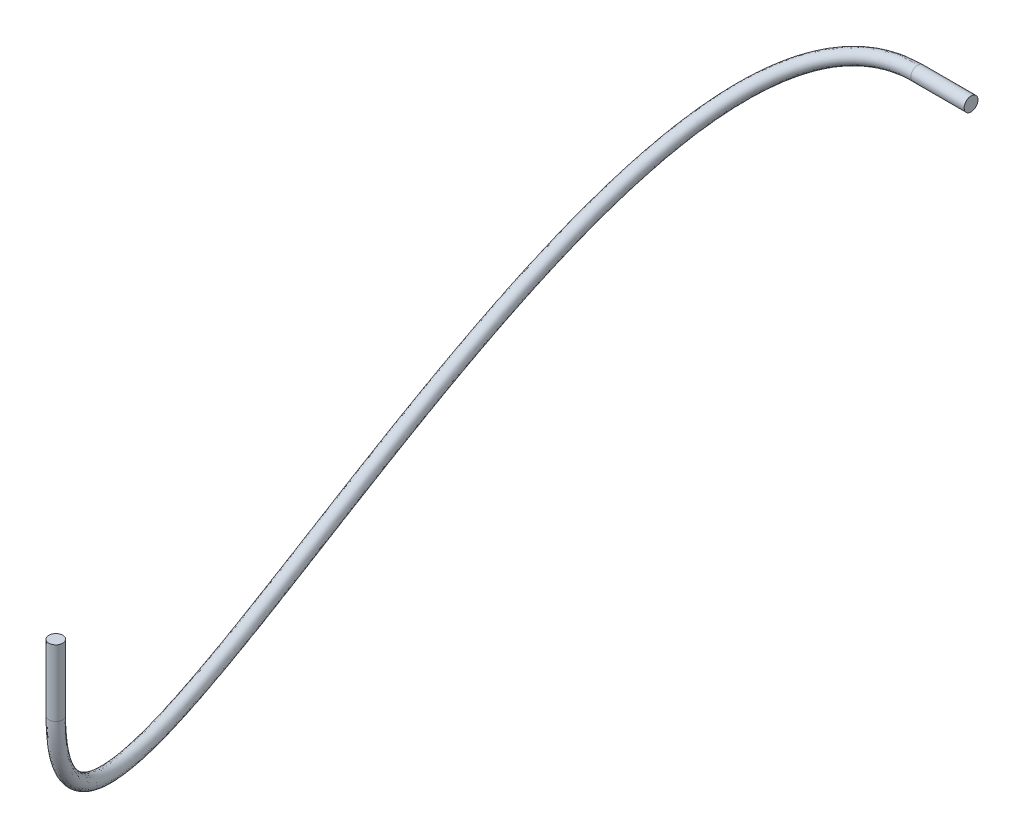
ISO-10303-21;
HEADER;
FILE_DESCRIPTION(('STEP AP214'),'2;1');
FILE_NAME('part.step','',(''),(''),'','','');
FILE_SCHEMA(('AUTOMOTIVE_DESIGN { 1 0 10303 214 1 1 1 1 }'));
ENDSEC;
DATA;
#1=APPLICATION_CONTEXT('core data for automotive mechanical design processes');
#2=APPLICATION_PROTOCOL_DEFINITION('international standard','automotive_design',2000,#1);
#3=PRODUCT_CONTEXT('',#1,'mechanical');
#4=PRODUCT('Part','Part','',(#3));
#5=PRODUCT_RELATED_PRODUCT_CATEGORY('part','',(#4));
#6=PRODUCT_DEFINITION_FORMATION('','',#4);
#7=PRODUCT_DEFINITION_CONTEXT('part definition',#1,'design');
#8=PRODUCT_DEFINITION('design','',#6,#7);
#9=PRODUCT_DEFINITION_SHAPE('','',#8);
#10=(LENGTH_UNIT() NAMED_UNIT(*) SI_UNIT(.MILLI.,.METRE.));
#11=(NAMED_UNIT(*) PLANE_ANGLE_UNIT() SI_UNIT($,.RADIAN.));
#12=(NAMED_UNIT(*) SI_UNIT($,.STERADIAN.) SOLID_ANGLE_UNIT());
#13=UNCERTAINTY_MEASURE_WITH_UNIT(LENGTH_MEASURE(1.E-05),#10,'distance_accuracy_value','');
#14=(GEOMETRIC_REPRESENTATION_CONTEXT(3) GLOBAL_UNCERTAINTY_ASSIGNED_CONTEXT((#13)) GLOBAL_UNIT_ASSIGNED_CONTEXT((#10,
#11,#12)) REPRESENTATION_CONTEXT('',''));
#15=CARTESIAN_POINT('',(0.,0.,0.));
#16=DIRECTION('',(0.,0.,1.));
#17=DIRECTION('',(1.,0.,0.));
#18=AXIS2_PLACEMENT_3D('',#15,#16,#17);
#19=CARTESIAN_POINT('',(646.870727642343,1249.72934639035,1820.03831058067));
#20=DIRECTION('',(0.,-1.,0.));
#21=DIRECTION('',(0.,0.,-1.));
#22=AXIS2_PLACEMENT_3D('',#19,#20,#21);
#23=PLANE('',#22);
#24=CARTESIAN_POINT('',(646.870727642343,1249.72934639035,1820.03831058067));
#25=DIRECTION('',(0.,-1.,0.));
#26=DIRECTION('',(0.,0.,-1.));
#27=AXIS2_PLACEMENT_3D('',#24,#25,#26);
#28=CIRCLE('',#27,1.58749999999996);
#29=CARTESIAN_POINT('',(646.870727642343,1249.72934639035,1818.45081058067));
#30=VERTEX_POINT('',#29);
#31=EDGE_CURVE('E29',#30,#30,#28,.T.);
#32=ORIENTED_EDGE('',*,*,#31,.F.);
#33=EDGE_LOOP('',(#32));
#34=FACE_BOUND('',#33,.T.);
#35=ADVANCED_FACE('F17',(#34),#23,.F.);
#36=CARTESIAN_POINT('',(685.016228202551,1289.24472214862,1648.58831058067));
#37=DIRECTION('',(1.,0.,0.));
#38=DIRECTION('',(0.,0.0125013075493396,0.999921855601502));
#39=AXIS2_PLACEMENT_3D('',#36,#37,#38);
#40=PLANE('',#39);
#41=CARTESIAN_POINT('',(685.016228202551,1289.24472214862,1648.58831058067));
#42=DIRECTION('',(1.,0.,0.));
#43=DIRECTION('',(0.,0.0125013075493396,0.999921855601502));
#44=AXIS2_PLACEMENT_3D('',#41,#42,#43);
#45=CIRCLE('',#44,1.58749999999996);
#46=CARTESIAN_POINT('',(685.016228202551,1289.26456797436,1650.17568652644));
#47=VERTEX_POINT('',#46);
#48=EDGE_CURVE('E11',#47,#47,#45,.T.);
#49=ORIENTED_EDGE('',*,*,#48,.T.);
#50=EDGE_LOOP('',(#49));
#51=FACE_BOUND('',#50,.T.);
#52=ADVANCED_FACE('F32',(#51),#40,.T.);
#53=CARTESIAN_POINT('',(646.870727642343,1249.72934639035,1820.03831058067));
#54=DIRECTION('',(0.,-1.,0.));
#55=DIRECTION('',(0.,0.,-1.));
#56=AXIS2_PLACEMENT_3D('',#53,#54,#55);
#57=CYLINDRICAL_SURFACE('',#56,1.58749999999996);
#58=CARTESIAN_POINT('',(646.870727642343,1234.53857464781,1820.03831058067));
#59=DIRECTION('',(0.,-1.,0.));
#60=DIRECTION('',(0.,0.,-1.));
#61=AXIS2_PLACEMENT_3D('',#58,#59,#60);
#62=CIRCLE('',#61,1.58749999999996);
#63=CARTESIAN_POINT('',(646.870727642343,1234.53857464781,1818.45081058067));
#64=VERTEX_POINT('',#63);
#65=EDGE_CURVE('E42',#64,#64,#62,.T.);
#66=ORIENTED_EDGE('',*,*,#65,.F.);
#67=EDGE_LOOP('',(#66));
#68=FACE_BOUND('',#67,.T.);
#69=ORIENTED_EDGE('',*,*,#31,.T.);
#70=EDGE_LOOP('',(#69));
#71=FACE_BOUND('',#70,.T.);
#72=ADVANCED_FACE('F47',(#68,#71),#57,.T.);
#73=CARTESIAN_POINT('',(646.870727642343,1234.53857464781,1818.45081058067));
#74=CARTESIAN_POINT('',(646.871111014455,1234.26297608393,1818.45081058067));
#75=CARTESIAN_POINT('',(646.871651579973,1234.01957151936,1818.44829338069));
#76=CARTESIAN_POINT('',(646.870769769792,1233.50993602631,1818.43828711573));
#77=CARTESIAN_POINT('',(646.869730766341,1233.25823561436,1818.43079805114));
#78=CARTESIAN_POINT('',(646.864854326608,1232.51243721798,1818.40096918273));
#79=CARTESIAN_POINT('',(646.859257306304,1232.02764315073,1818.37126697526));
#80=CARTESIAN_POINT('',(646.835712830713,1230.6100487227,1818.25350752651));
#81=CARTESIAN_POINT('',(646.811010561163,1229.71406310045,1818.13679000847));
#82=CARTESIAN_POINT('',(646.712236878075,1227.16914966337,1817.67872846635));
#83=CARTESIAN_POINT('',(646.613568683435,1225.66395058645,1817.22975768597));
#84=CARTESIAN_POINT('',(646.237308832709,1221.66923550916,1815.50405131608));
#85=CARTESIAN_POINT('',(645.882474667889,1219.69256861937,1813.8634797587));
#86=CARTESIAN_POINT('',(645.006634296035,1216.74767967916,1809.62439136021));
#87=CARTESIAN_POINT('',(644.480723586618,1215.78514763016,1807.00250488682));
#88=CARTESIAN_POINT('',(643.310820761465,1214.82336910638,1800.81116740816));
#89=CARTESIAN_POINT('',(642.668934926617,1214.8297899351,1797.25068778283));
#90=CARTESIAN_POINT('',(641.359092655909,1215.7184490174,1789.39880338184));
#91=CARTESIAN_POINT('',(640.69146475475,1216.59882969686,1785.10865935511));
#92=CARTESIAN_POINT('',(639.733638316708,1218.46111670595,1778.27008636294));
#93=CARTESIAN_POINT('',(639.421577109346,1219.17194707477,1775.92317863896));
#94=CARTESIAN_POINT('',(638.971440867184,1220.35800065828,1772.31847324798));
#95=CARTESIAN_POINT('',(638.824381994204,1220.77331466899,1771.1028412044));
#96=CARTESIAN_POINT('',(638.537340401936,1221.6412790461,1768.64617875244));
#97=CARTESIAN_POINT('',(638.401080676944,1222.09143625192,1767.40370433318));
#98=CARTESIAN_POINT('',(637.954275444529,1223.52677358892,1763.66122165702));
#99=CARTESIAN_POINT('',(637.652311664496,1224.56810077761,1761.12959541868));
#100=CARTESIAN_POINT('',(637.103006731896,1226.76630383592,1755.99519158739));
#101=CARTESIAN_POINT('',(636.847213312586,1227.92853531873,1753.39551970427));
#102=CARTESIAN_POINT('',(636.150289690967,1231.57542025546,1745.53146855268));
#103=CARTESIAN_POINT('',(635.77963580898,1234.22026883279,1740.20209121974));
#104=CARTESIAN_POINT('',(635.059908643557,1242.56152425045,1724.21059223068));
#105=CARTESIAN_POINT('',(635.103430117707,1248.66485713255,1713.54498592059));
#106=CARTESIAN_POINT('',(636.175254243222,1256.18957917758,1701.05820923784));
#107=CARTESIAN_POINT('',(636.485386005357,1257.65825331353,1698.58895428685));
#108=CARTESIAN_POINT('',(637.179296557353,1260.585972764,1693.76798754144));
#109=CARTESIAN_POINT('',(637.578043456154,1262.03558849098,1691.41166692554));
#110=CARTESIAN_POINT('',(638.944558592429,1266.31245358119,1684.53766135292));
#111=CARTESIAN_POINT('',(640.083003773891,1269.06783578663,1680.21491835086));
#112=CARTESIAN_POINT('',(644.289620255754,1276.80509196164,1668.28564128992));
#113=CARTESIAN_POINT('',(648.158441097511,1281.24985968087,1661.72920998266));
#114=CARTESIAN_POINT('',(655.845970580093,1285.91769776802,1654.95436729748));
#115=CARTESIAN_POINT('',(658.716694326886,1287.14320424869,1653.20197683011));
#116=CARTESIAN_POINT('',(663.559176450191,1288.40043947704,1651.41147065174));
#117=CARTESIAN_POINT('',(665.263874157113,1288.72285974785,1650.95410585101));
#118=CARTESIAN_POINT('',(667.973142202439,1289.04857040017,1650.49064270717));
#119=CARTESIAN_POINT('',(668.901625677796,1289.1307817857,1650.37330823044));
#120=CARTESIAN_POINT('',(670.334430349413,1289.21260597592,1650.25518751868));
#121=CARTESIAN_POINT('',(670.818709840188,1289.23296300187,1650.22546389065));
#122=CARTESIAN_POINT('',(671.555371191882,1289.25286070595,1650.19564580449));
#123=CARTESIAN_POINT('',(671.802631803935,1289.257720201,1650.18816780726));
#124=CARTESIAN_POINT('',(672.176109303474,1289.26231638267,1650.18068050096));
#125=CARTESIAN_POINT('',(672.30103288705,1289.26339959499,1650.17880635387));
#126=CARTESIAN_POINT('',(672.551746452333,1289.26466269394,1650.17630764995));
#127=CARTESIAN_POINT('',(672.668116787371,1289.26470527748,1650.17568480984));
#128=CARTESIAN_POINT('',(672.803761676136,1289.26456797436,1650.17568652644));
#129=CARTESIAN_POINT('',(650.045727642343,1234.53857464781,1818.45081058067));
#130=CARTESIAN_POINT('',(650.046111014455,1234.26051358605,1818.4515773249));
#131=CARTESIAN_POINT('',(650.04663901666,1234.00961955032,1818.45130871072));
#132=CARTESIAN_POINT('',(650.045704471831,1233.48972221569,1818.44415198025));
#133=CARTESIAN_POINT('',(650.044625296981,1233.23278693083,1818.43803060852));
#134=CARTESIAN_POINT('',(650.039582958189,1232.47096717657,1818.41211617891));
#135=CARTESIAN_POINT('',(650.033814902078,1231.97506937433,1818.38477243453));
#136=CARTESIAN_POINT('',(650.009541345196,1230.52287202181,1818.27318229347));
#137=CARTESIAN_POINT('',(649.984065770865,1229.60208264247,1818.159373227));
#138=CARTESIAN_POINT('',(649.881796711612,1226.97773452777,1817.70502791702));
#139=CARTESIAN_POINT('',(649.779198130524,1225.41255348987,1817.25172135243));
#140=CARTESIAN_POINT('',(649.384101527366,1221.22774416757,1815.48221262828));
#141=CARTESIAN_POINT('',(649.005896149604,1219.11475835608,1813.76419924404));
#142=CARTESIAN_POINT('',(648.075811852759,1215.97358697347,1809.3408200607));
#143=CARTESIAN_POINT('',(647.521449540306,1214.94836633545,1806.62337578764));
#144=CARTESIAN_POINT('',(646.296576919584,1213.87668245736,1800.28296225262));
#145=CARTESIAN_POINT('',(645.627272865263,1213.83313122977,1796.66463570355));
#146=CARTESIAN_POINT('',(644.24862015131,1214.59426332894,1788.70932070166));
#147=CARTESIAN_POINT('',(643.539612627393,1215.39777656734,1784.37290599246));
#148=CARTESIAN_POINT('',(642.49365515387,1217.11577616256,1777.45966263831));
#149=CARTESIAN_POINT('',(642.147808953117,1217.77380133101,1775.08706176901));
#150=CARTESIAN_POINT('',(641.637938262787,1218.87371673018,1771.4417051133));
#151=CARTESIAN_POINT('',(641.469455409649,1219.25917342881,1770.21217665141));
#152=CARTESIAN_POINT('',(641.136121242577,1220.06530587951,1767.72695781347));
#153=CARTESIAN_POINT('',(640.969320471733,1220.47631509508,1766.46758057126));
#154=CARTESIAN_POINT('',(640.499533362797,1221.88849223251,1762.70256629763));
#155=CARTESIAN_POINT('',(640.208935181845,1222.94910250975,1760.16877577023));
#156=CARTESIAN_POINT('',(639.65858514655,1225.15149712575,1755.024587727));
#157=CARTESIAN_POINT('',(639.402531467872,1226.31502998528,1752.42208456058));
#158=CARTESIAN_POINT('',(638.705336887106,1229.96336376267,1744.55492467182));
#159=CARTESIAN_POINT('',(638.335180387225,1232.60592269136,1739.23056276294));
#160=CARTESIAN_POINT('',(637.616986616615,1240.92942046323,1723.27311109758));
#161=CARTESIAN_POINT('',(637.662475692529,1247.0072878358,1712.65422646883));
#162=CARTESIAN_POINT('',(638.725550239804,1254.47068529544,1700.2691677278));
#163=CARTESIAN_POINT('',(638.96580966202,1255.85170050242,1697.77037461263));
#164=CARTESIAN_POINT('',(639.565764086749,1258.66456246542,1692.93182819214));
#165=CARTESIAN_POINT('',(639.91954120981,1260.06183634076,1690.57109702604));
#166=CARTESIAN_POINT('',(641.156967741238,1264.19202329756,1683.69705780425));
#167=CARTESIAN_POINT('',(642.217681494518,1266.86323248955,1679.39174459594));
#168=CARTESIAN_POINT('',(646.19163984272,1274.35360125649,1667.57177952335));
#169=CARTESIAN_POINT('',(649.91738226379,1278.62776348736,1661.18041735001));
#170=CARTESIAN_POINT('',(657.113352634287,1283.00745940945,1654.72560293798));
#171=CARTESIAN_POINT('',(659.765907811321,1284.13619290896,1653.08606652452));
#172=CARTESIAN_POINT('',(664.223248894051,1285.29262088412,1651.40510950765));
#173=CARTESIAN_POINT('',(665.791630482325,1285.58910529232,1650.97399657338));
#174=CARTESIAN_POINT('',(668.298268329653,1285.88977905677,1650.53106352526));
#175=CARTESIAN_POINT('',(669.159552190791,1285.96589840314,1650.41751427163));
#176=CARTESIAN_POINT('',(670.493704658263,1286.04175988889,1650.30076501622));
#177=CARTESIAN_POINT('',(670.945455063429,1286.06065527689,1650.27078543398));
#178=CARTESIAN_POINT('',(671.634024967309,1286.07909867117,1650.23958387857));
#179=CARTESIAN_POINT('',(671.865371845809,1286.08359627179,1650.2314783417));
#180=CARTESIAN_POINT('',(672.21517241217,1286.08782640911,1650.22281053328));
#181=CARTESIAN_POINT('',(672.332235943241,1286.08881706565,1650.22050302995));
#182=CARTESIAN_POINT('',(672.567296776497,1286.0899526389,1650.21705974172));
#183=CARTESIAN_POINT('',(672.671995609707,1286.08995681915,1650.21565106754));
#184=CARTESIAN_POINT('',(672.803761676136,1286.08981608282,1650.21537817791));
#185=CARTESIAN_POINT('',(650.045727642343,1234.53857464781,1821.62581058067));
#186=CARTESIAN_POINT('',(650.045344270231,1234.25030721897,1821.6265773249));
#187=CARTESIAN_POINT('',(650.043528755185,1233.96843627356,1821.62611087204));
#188=CARTESIAN_POINT('',(650.039344056085,1233.40626911982,1821.61811946988));
#189=CARTESIAN_POINT('',(650.036591499667,1233.12783453915,1821.61136126474));
#190=CARTESIAN_POINT('',(650.02636802648,1232.30040843206,1821.58280822954));
#191=CARTESIAN_POINT('',(650.016931537446,1231.75929295069,1821.55273606436));
#192=CARTESIAN_POINT('',(649.980869359097,1230.16694677091,1821.42944153913));
#193=CARTESIAN_POINT('',(649.946493072387,1229.14667652501,1821.30315228628));
#194=CARTESIAN_POINT('',(649.813128946622,1226.20684523814,1820.79173364991));
#195=CARTESIAN_POINT('',(649.68380289298,1224.40725070668,1820.27363671159));
#196=CARTESIAN_POINT('',(649.181599123842,1219.49543978669,1818.18832881484));
#197=CARTESIAN_POINT('',(648.690063781805,1216.88217084782,1816.0679624474));
#198=CARTESIAN_POINT('',(647.512350518253,1213.12791495109,1810.74658819222));
#199=CARTESIAN_POINT('',(646.83349820591,1211.97851292308,1807.58024107757));
#200=CARTESIAN_POINT('',(645.389009581046,1210.8259627798,1800.56283453919));
#201=CARTESIAN_POINT('',(644.620366957091,1210.81439206796,1796.69847505079));
#202=CARTESIAN_POINT('',(643.034893786171,1211.67161424029,1788.37349134778));
#203=CARTESIAN_POINT('',(642.217747306754,1212.54295219292,1783.9109193807));
#204=CARTESIAN_POINT('',(640.987022913063,1214.38435197129,1776.86171165991));
#205=CARTESIAN_POINT('',(640.575937915382,1215.08755698701,1774.45298238786));
#206=CARTESIAN_POINT('',(639.962201697834,1216.26280889607,1770.76515358383));
#207=CARTESIAN_POINT('',(639.758107884941,1216.67464926369,1769.52343370082));
#208=CARTESIAN_POINT('',(639.351656713701,1217.53642211281,1767.01753861008));
#209=CARTESIAN_POINT('',(639.13990390768,1217.98167437808,1765.75256455072));
#210=CARTESIAN_POINT('',(638.633132565791,1219.43589513158,1761.93809180097));
#211=CARTESIAN_POINT('',(638.355158491863,1220.50105777299,1759.3608887136));
#212=CARTESIAN_POINT('',(637.797311724294,1222.7334608811,1754.14660451996));
#213=CARTESIAN_POINT('',(637.538041739688,1223.91173863798,1751.51120635167));
#214=CARTESIAN_POINT('',(636.832506869211,1227.60374586299,1743.54985872936));
#215=CARTESIAN_POINT('',(636.458495638861,1230.27466282801,1738.16862648572));
#216=CARTESIAN_POINT('',(635.732927750739,1238.68363858094,1722.04729779574));
#217=CARTESIAN_POINT('',(635.778366976327,1244.81859710769,1711.32837578701));
#218=CARTESIAN_POINT('',(636.853537883352,1252.36709993782,1698.8021243202));
#219=CARTESIAN_POINT('',(637.007032867367,1253.82791942597,1696.30260770712));
#220=CARTESIAN_POINT('',(637.50917897167,1256.76134496306,1691.43681753331));
#221=CARTESIAN_POINT('',(637.821975994448,1258.21823729802,1689.05878375069));
#222=CARTESIAN_POINT('',(638.957906701609,1262.52560791398,1682.1196453216));
#223=CARTESIAN_POINT('',(639.978744188276,1265.31248069409,1677.75337280417));
#224=CARTESIAN_POINT('',(643.918256728885,1273.15962182501,1665.68180560766));
#225=CARTESIAN_POINT('',(647.715875379719,1277.7011060181,1659.00877479428));
#226=CARTESIAN_POINT('',(655.465639194588,1282.52259069393,1652.03938794275));
#227=CARTESIAN_POINT('',(658.388793605056,1283.79982934589,1650.22113637082));
#228=CARTESIAN_POINT('',(663.342770138126,1285.11888091728,1648.3539797945));
#229=CARTESIAN_POINT('',(665.089544482314,1285.45919228331,1647.8748645281));
#230=CARTESIAN_POINT('',(667.86394660975,1285.80680923336,1647.38566135756));
#231=CARTESIAN_POINT('',(668.81446666364,1285.89552118047,1647.26086583454));
#232=CARTESIAN_POINT('',(670.280185997938,1285.98596177995,1647.13313472132));
#233=CARTESIAN_POINT('',(670.775414740148,1286.00900302099,1647.10046955957));
#234=CARTESIAN_POINT('',(671.528400413248,1286.03266242753,1647.06660783363));
#235=CARTESIAN_POINT('',(671.78108597397,1286.03873177209,1647.05784332878));
#236=CARTESIAN_POINT('',(672.162668852246,1286.04507921926,1647.04851473176));
#237=CARTESIAN_POINT('',(672.290288894918,1286.04673560448,1647.04604156276));
#238=CARTESIAN_POINT('',(672.546383576803,1286.04912434057,1647.0423736629));
#239=CARTESIAN_POINT('',(672.666777678338,1286.04999056144,1647.04090260922));
#240=CARTESIAN_POINT('',(672.803761676136,1286.05012443135,1647.04062628638));
#241=CARTESIAN_POINT('',(646.870727642343,1234.53857464781,1821.62581058067));
#242=CARTESIAN_POINT('',(646.870344270231,1234.25276971685,1821.62581058067));
#243=CARTESIAN_POINT('',(646.868541318499,1233.97838824259,1821.62309554201));
#244=CARTESIAN_POINT('',(646.864409354046,1233.42648293044,1821.61225460537));
#245=CARTESIAN_POINT('',(646.861696969027,1233.15328322268,1821.60412870736));
#246=CARTESIAN_POINT('',(646.851639394899,1232.34187847347,1821.57166123336));
#247=CARTESIAN_POINT('',(646.842373941673,1231.8118667271,1821.53923060511));
#248=CARTESIAN_POINT('',(646.807040844615,1230.25412347181,1821.40976677212));
#249=CARTESIAN_POINT('',(646.773437862686,1229.25865698299,1821.28056906765));
#250=CARTESIAN_POINT('',(646.643569113084,1226.39826037373,1820.76543419944));
#251=CARTESIAN_POINT('',(646.518173445891,1224.65864780335,1820.25167304513));
#252=CARTESIAN_POINT('',(646.034806429185,1219.9369311281,1818.21016750264));
#253=CARTESIAN_POINT('',(645.56664230001,1217.45998111111,1816.16724296238));
#254=CARTESIAN_POINT('',(644.44317296161,1213.90200765677,1811.03015949141));
#255=CARTESIAN_POINT('',(643.792772252221,1212.81529421761,1807.95937017675));
#256=CARTESIAN_POINT('',(642.403253422927,1211.772649429,1801.09103969472));
#257=CARTESIAN_POINT('',(641.662029018445,1211.81105077329,1797.28452713007));
#258=CARTESIAN_POINT('',(640.14536629077,1212.79579992876,1789.06297402795));
#259=CARTESIAN_POINT('',(639.369599434111,1213.74400532137,1784.64667274334));
#260=CARTESIAN_POINT('',(638.2270060759,1215.72969251522,1777.67213538454));
#261=CARTESIAN_POINT('',(637.849706071611,1216.48570273105,1775.28909925766));
#262=CARTESIAN_POINT('',(637.295704302231,1217.74709282403,1771.64192171859));
#263=CARTESIAN_POINT('',(637.113034469495,1218.18879050373,1770.41409825381));
#264=CARTESIAN_POINT('',(636.75287587306,1219.11239527954,1767.93675954906));
#265=CARTESIAN_POINT('',(636.57166411289,1219.59679553492,1766.68868831272));
#266=CARTESIAN_POINT('',(636.087874647523,1221.07417648799,1762.89674716021));
#267=CARTESIAN_POINT('',(635.798534974514,1222.12005604117,1760.32170836174));
#268=CARTESIAN_POINT('',(635.24173330964,1224.34826759095,1755.11720838066));
#269=CARTESIAN_POINT('',(634.982723584402,1225.52524397143,1752.48464149568));
#270=CARTESIAN_POINT('',(634.277459673072,1229.21580235578,1744.52640260958));
#271=CARTESIAN_POINT('',(633.902951060615,1231.88900897078,1739.14015494219));
#272=CARTESIAN_POINT('',(633.175849777681,1240.31574236547,1722.98477892951));
#273=CARTESIAN_POINT('',(633.219321401506,1246.47616640575,1712.21913523876));
#274=CARTESIAN_POINT('',(634.30324188677,1254.08599381962,1699.59116583025));
#275=CARTESIAN_POINT('',(634.526609210704,1255.63447223739,1697.12118738149));
#276=CARTESIAN_POINT('',(635.122711442274,1258.68275526132,1692.27297688245));
#277=CARTESIAN_POINT('',(635.480478240793,1260.19198944824,1689.89935365019));
#278=CARTESIAN_POINT('',(636.7454975528,1264.64603819762,1682.96024887028));
#279=CARTESIAN_POINT('',(637.844066467926,1267.51708399116,1678.57654655936));
#280=CARTESIAN_POINT('',(642.016237141363,1275.61111253016,1666.39566737368));
#281=CARTESIAN_POINT('',(645.956934213439,1280.32320221161,1659.55756742693));
#282=CARTESIAN_POINT('',(654.198257140393,1285.4328290525,1652.26815230225));
#283=CARTESIAN_POINT('',(657.339580120828,1286.80684068562,1650.33704667661));
#284=CARTESIAN_POINT('',(662.678697694162,1288.2266995102,1648.36034093848));
#285=CARTESIAN_POINT('',(664.561788156995,1288.59294673884,1647.85497380574));
#286=CARTESIAN_POINT('',(667.538820482589,1288.96560057677,1647.34524053948));
#287=CARTESIAN_POINT('',(668.556540150644,1289.06040456298,1647.21665979334));
#288=CARTESIAN_POINT('',(670.120911689088,1289.15680786701,1647.08755722378));
#289=CARTESIAN_POINT('',(670.648669516935,1289.18131074602,1647.05514801624));
#290=CARTESIAN_POINT('',(671.449746637807,1289.20642446229,1647.02266975955));
#291=CARTESIAN_POINT('',(671.718345932097,1289.21285570129,1647.01453279433));
#292=CARTESIAN_POINT('',(672.123605743551,1289.21956919282,1647.00638469943));
#293=CARTESIAN_POINT('',(672.259085838727,1289.22131813381,1647.00434488668));
#294=CARTESIAN_POINT('',(672.53083325264,1289.22383439562,1647.00162157113));
#295=CARTESIAN_POINT('',(672.662898856002,1289.22473901977,1647.00093635151));
#296=CARTESIAN_POINT('',(672.803761676136,1289.22487632289,1647.00093463491));
#297=CARTESIAN_POINT('',(643.695727642343,1234.53857464781,1821.62581058067));
#298=CARTESIAN_POINT('',(643.695344270232,1234.25523221473,1821.62504383645));
#299=CARTESIAN_POINT('',(643.693553881812,1233.98834021163,1821.62008021199));
#300=CARTESIAN_POINT('',(643.689474652007,1233.44669674105,1821.60638974085));
#301=CARTESIAN_POINT('',(643.686802438387,1233.17873190621,1821.59689614999));
#302=CARTESIAN_POINT('',(643.676910763318,1232.38334851488,1821.56051423719));
#303=CARTESIAN_POINT('',(643.6678163459,1231.8644405035,1821.52572514587));
#304=CARTESIAN_POINT('',(643.633212330132,1230.3413001727,1821.3900920051));
#305=CARTESIAN_POINT('',(643.600382652985,1229.37063744098,1821.25798584902));
#306=CARTESIAN_POINT('',(643.474009279547,1226.58967550933,1820.73913474898));
#307=CARTESIAN_POINT('',(643.352543998802,1224.91004490002,1820.22970937867));
#308=CARTESIAN_POINT('',(642.888013734527,1220.37842246951,1818.23200619044));
#309=CARTESIAN_POINT('',(642.443220818215,1218.0377913744,1816.26652347736));
#310=CARTESIAN_POINT('',(641.373995404967,1214.67610036246,1811.3137307906));
#311=CARTESIAN_POINT('',(640.752046298533,1213.65207551213,1808.33849927592));
#312=CARTESIAN_POINT('',(639.417497264809,1212.71933607821,1801.61924485026));
#313=CARTESIAN_POINT('',(638.703691079799,1212.80770947862,1797.87057920935));
#314=CARTESIAN_POINT('',(637.255838795369,1213.91998561723,1789.75245670813));
#315=CARTESIAN_POINT('',(636.521451561467,1214.94505844981,1785.38242610599));
#316=CARTESIAN_POINT('',(635.466989238738,1217.07503305915,1778.48255910917));
#317=CARTESIAN_POINT('',(635.12347422784,1217.8838484751,1776.12521612746));
#318=CARTESIAN_POINT('',(634.629206906627,1219.23137675199,1772.51868985334));
#319=CARTESIAN_POINT('',(634.46796105405,1219.70293174376,1771.3047628068));
#320=CARTESIAN_POINT('',(634.154095032418,1220.68836844627,1768.85598048803));
#321=CARTESIAN_POINT('',(634.003424318101,1221.21191669176,1767.62481207472));
#322=CARTESIAN_POINT('',(633.542616729255,1222.7124578444,1763.85540251944));
#323=CARTESIAN_POINT('',(633.241911457165,1223.73905430935,1761.28252800988));
#324=CARTESIAN_POINT('',(632.686154894987,1225.9630743008,1756.08781224137));
#325=CARTESIAN_POINT('',(632.427405429116,1227.13874930487,1753.45807663969));
#326=CARTESIAN_POINT('',(631.722412476933,1230.82785884857,1745.5029464898));
#327=CARTESIAN_POINT('',(631.34740648237,1233.50335511355,1740.11168339865));
#328=CARTESIAN_POINT('',(630.618771804623,1241.94784615,1723.92226006328));
#329=CARTESIAN_POINT('',(630.660275826685,1248.13373570381,1713.10989469052));
#330=CARTESIAN_POINT('',(631.752945890188,1255.80488770143,1700.3802073403));
#331=CARTESIAN_POINT('',(632.04618555404,1257.44102504881,1697.93976705587));
#332=CARTESIAN_POINT('',(632.736243912878,1260.60416555958,1693.10913623159));
#333=CARTESIAN_POINT('',(633.138980487137,1262.16574159847,1690.73992354969));
#334=CARTESIAN_POINT('',(634.533088403992,1266.76646848126,1683.80085241895));
#335=CARTESIAN_POINT('',(635.709388747576,1269.72168728824,1679.39972031456));
#336=CARTESIAN_POINT('',(640.11421755384,1278.0626032353,1667.10952913969));
#337=CARTESIAN_POINT('',(644.19799304716,1282.94529840511,1660.10636005958));
#338=CARTESIAN_POINT('',(652.930875086199,1288.34306741106,1652.49691666175));
#339=CARTESIAN_POINT('',(656.290366636599,1289.81385202535,1650.4529569824));
#340=CARTESIAN_POINT('',(662.014625250198,1291.33451810311,1648.36670208247));
#341=CARTESIAN_POINT('',(664.034031831676,1291.72670119438,1647.83508308337));
#342=CARTESIAN_POINT('',(667.213694355429,1292.12439192017,1647.30481972139));
#343=CARTESIAN_POINT('',(668.298613637649,1292.22528794548,1647.17245375215));
#344=CARTESIAN_POINT('',(669.961637380238,1292.32765395406,1647.04197972623));
#345=CARTESIAN_POINT('',(670.521924293722,1292.35361847106,1647.00982647291));
#346=CARTESIAN_POINT('',(671.371092862365,1292.38018649705,1646.97873168547));
#347=CARTESIAN_POINT('',(671.655605890223,1292.3869796305,1646.97122225989));
#348=CARTESIAN_POINT('',(672.084542634855,1292.39405916638,1646.96425466711));
#349=CARTESIAN_POINT('',(672.227882782536,1292.39590066315,1646.9626482106));
#350=CARTESIAN_POINT('',(672.515282928476,1292.39854445066,1646.96086947936));
#351=CARTESIAN_POINT('',(672.659020033667,1292.3994874781,1646.9609700938));
#352=CARTESIAN_POINT('',(672.803761676136,1292.39962821442,1646.96124298344));
#353=CARTESIAN_POINT('',(643.695727642343,1234.53857464781,1818.45081058067));
#354=CARTESIAN_POINT('',(643.696111014455,1234.26543858181,1818.45004383645));
#355=CARTESIAN_POINT('',(643.696664143287,1234.02952348839,1818.44527805067));
#356=CARTESIAN_POINT('',(643.695835067753,1233.53014983692,1818.43242225121));
#357=CARTESIAN_POINT('',(643.694836235701,1233.28368429789,1818.42356549376));
#358=CARTESIAN_POINT('',(643.690125695027,1232.55390725939,1818.38982218656));
#359=CARTESIAN_POINT('',(643.684699710531,1232.08021692714,1818.35776151599));
#360=CARTESIAN_POINT('',(643.66188431623,1230.69722542359,1818.23383275955));
#361=CARTESIAN_POINT('',(643.637955351463,1229.82604355844,1818.11420678994));
#362=CARTESIAN_POINT('',(643.542677044537,1227.36056479896,1817.65242901568));
#363=CARTESIAN_POINT('',(643.447939236346,1225.91534768303,1817.20779401951));
#364=CARTESIAN_POINT('',(643.090516138052,1222.11072685074,1815.52589000389));
#365=CARTESIAN_POINT('',(642.759053186175,1220.27037888266,1813.96276027336));
#366=CARTESIAN_POINT('',(641.937456739312,1217.52177238484,1809.90796265972));
#367=CARTESIAN_POINT('',(641.439997632929,1216.62192892487,1807.38163398599));
#368=CARTESIAN_POINT('',(640.325064603347,1215.7700557554,1801.33937256369));
#369=CARTESIAN_POINT('',(639.710596987971,1215.82644864043,1797.83673986211));
#370=CARTESIAN_POINT('',(638.469565160508,1216.84263470587,1790.08828606202));
#371=CARTESIAN_POINT('',(637.843316882107,1217.79988282637,1785.84441271776));
#372=CARTESIAN_POINT('',(636.973621479545,1219.80645724934,1779.08051008757));
#373=CARTESIAN_POINT('',(636.695345265574,1220.57009281853,1776.7592955089));
#374=CARTESIAN_POINT('',(636.304943471581,1221.84228458638,1773.19524138266));
#375=CARTESIAN_POINT('',(636.179308578759,1222.28745590917,1771.99350575738));
#376=CARTESIAN_POINT('',(635.938559561294,1223.21725221268,1769.56539969142));
#377=CARTESIAN_POINT('',(635.832840882154,1223.70655740876,1768.33982809511));
#378=CARTESIAN_POINT('',(635.40901752626,1225.16505494533,1764.6198770164));
#379=CARTESIAN_POINT('',(635.095688147147,1226.18709904548,1762.09041506714));
#380=CARTESIAN_POINT('',(634.547428317242,1228.38111054608,1756.96579544778));
#381=CARTESIAN_POINT('',(634.291895157299,1229.54204065217,1754.36895484796));
#382=CARTESIAN_POINT('',(633.595242494828,1233.18747674825,1746.50801243355));
#383=CARTESIAN_POINT('',(633.224091230734,1235.83461497421,1741.17361967653));
#384=CARTESIAN_POINT('',(632.502830670499,1244.19362803766,1725.14807336379));
#385=CARTESIAN_POINT('',(632.544384542886,1250.32242642931,1714.43574537234));
#386=CARTESIAN_POINT('',(633.624958246641,1257.90847305971,1701.84725074789));
#387=CARTESIAN_POINT('',(634.004962348693,1259.46480612463,1699.40753396106));
#388=CARTESIAN_POINT('',(634.792829027957,1262.50738306258,1694.60414689074));
#389=CARTESIAN_POINT('',(635.236545702498,1264.00934064121,1692.25223682504));
#390=CARTESIAN_POINT('',(636.732149443621,1268.43288386483,1685.3782649016));
#391=CARTESIAN_POINT('',(637.948326053262,1271.2724390837,1681.03809210578));
#392=CARTESIAN_POINT('',(642.387600668786,1279.25658266678,1668.99950305649));
#393=CARTESIAN_POINT('',(646.399499931232,1283.87195587437,1662.27800261531));
#394=CARTESIAN_POINT('',(654.578588525899,1288.82793612658,1655.18313165697));
#395=CARTESIAN_POINT('',(657.66748084245,1290.15021558843,1653.31788713569));
#396=CARTESIAN_POINT('',(662.89510400633,1291.50825806995,1651.41783179583));
#397=CARTESIAN_POINT('',(664.736117831902,1291.85661420338,1650.93421512865));
#398=CARTESIAN_POINT('',(667.648016075225,1292.20736174358,1650.45022188909));
#399=CARTESIAN_POINT('',(668.6436991648,1292.29566516826,1650.32910218924));
#400=CARTESIAN_POINT('',(670.175156040563,1292.38345206294,1650.20961002113));
#401=CARTESIAN_POINT('',(670.691964616946,1292.40527072685,1650.18014234732));
#402=CARTESIAN_POINT('',(671.476717416455,1292.42662274074,1650.15170773041));
#403=CARTESIAN_POINT('',(671.739891762062,1292.4318441302,1650.14485727281));
#404=CARTESIAN_POINT('',(672.137046194778,1292.43680635623,1650.13855046863));
#405=CARTESIAN_POINT('',(672.269829830859,1292.43798212432,1650.13710967779));
#406=CARTESIAN_POINT('',(672.536196128169,1292.43937274899,1650.13555555818));
#407=CARTESIAN_POINT('',(672.664237965035,1292.43945373581,1650.13571855213));
#408=CARTESIAN_POINT('',(672.803761676136,1292.43931986589,1650.13599487497));
#409=CARTESIAN_POINT('',(646.870727642343,1234.53857464781,1818.45081058067));
#410=CARTESIAN_POINT('',(646.871111014455,1234.26297608393,1818.45081058067));
#411=CARTESIAN_POINT('',(646.871651579973,1234.01957151936,1818.44829338069));
#412=CARTESIAN_POINT('',(646.870769769792,1233.50993602631,1818.43828711573));
#413=CARTESIAN_POINT('',(646.869730766341,1233.25823561436,1818.43079805114));
#414=CARTESIAN_POINT('',(646.864854326608,1232.51243721798,1818.40096918273));
#415=CARTESIAN_POINT('',(646.859257306304,1232.02764315073,1818.37126697526));
#416=CARTESIAN_POINT('',(646.835712830713,1230.6100487227,1818.25350752651));
#417=CARTESIAN_POINT('',(646.811010561163,1229.71406310045,1818.13679000847));
#418=CARTESIAN_POINT('',(646.712236878075,1227.16914966337,1817.67872846635));
#419=CARTESIAN_POINT('',(646.613568683435,1225.66395058645,1817.22975768597));
#420=CARTESIAN_POINT('',(646.237308832709,1221.66923550916,1815.50405131608));
#421=CARTESIAN_POINT('',(645.882474667889,1219.69256861937,1813.8634797587));
#422=CARTESIAN_POINT('',(645.006634296035,1216.74767967916,1809.62439136021));
#423=CARTESIAN_POINT('',(644.480723586618,1215.78514763016,1807.00250488682));
#424=CARTESIAN_POINT('',(643.310820761465,1214.82336910638,1800.81116740816));
#425=CARTESIAN_POINT('',(642.668934926617,1214.8297899351,1797.25068778283));
#426=CARTESIAN_POINT('',(641.359092655909,1215.7184490174,1789.39880338184));
#427=CARTESIAN_POINT('',(640.69146475475,1216.59882969686,1785.10865935511));
#428=CARTESIAN_POINT('',(639.733638316708,1218.46111670595,1778.27008636294));
#429=CARTESIAN_POINT('',(639.421577109346,1219.17194707477,1775.92317863896));
#430=CARTESIAN_POINT('',(638.971440867184,1220.35800065828,1772.31847324798));
#431=CARTESIAN_POINT('',(638.824381994204,1220.77331466899,1771.1028412044));
#432=CARTESIAN_POINT('',(638.537340401936,1221.6412790461,1768.64617875244));
#433=CARTESIAN_POINT('',(638.401080676944,1222.09143625192,1767.40370433318));
#434=CARTESIAN_POINT('',(637.954275444529,1223.52677358892,1763.66122165702));
#435=CARTESIAN_POINT('',(637.652311664496,1224.56810077761,1761.12959541868));
#436=CARTESIAN_POINT('',(637.103006731896,1226.76630383592,1755.99519158739));
#437=CARTESIAN_POINT('',(636.847213312586,1227.92853531873,1753.39551970427));
#438=CARTESIAN_POINT('',(636.150289690967,1231.57542025546,1745.53146855268));
#439=CARTESIAN_POINT('',(635.77963580898,1234.22026883279,1740.20209121974));
#440=CARTESIAN_POINT('',(635.059908643557,1242.56152425045,1724.21059223068));
#441=CARTESIAN_POINT('',(635.103430117707,1248.66485713255,1713.54498592059));
#442=CARTESIAN_POINT('',(636.175254243222,1256.18957917758,1701.05820923784));
#443=CARTESIAN_POINT('',(636.485386005357,1257.65825331353,1698.58895428685));
#444=CARTESIAN_POINT('',(637.179296557353,1260.585972764,1693.76798754144));
#445=CARTESIAN_POINT('',(637.578043456154,1262.03558849098,1691.41166692554));
#446=CARTESIAN_POINT('',(638.944558592429,1266.31245358119,1684.53766135292));
#447=CARTESIAN_POINT('',(640.083003773891,1269.06783578663,1680.21491835086));
#448=CARTESIAN_POINT('',(644.289620255754,1276.80509196164,1668.28564128992));
#449=CARTESIAN_POINT('',(648.158441097511,1281.24985968087,1661.72920998266));
#450=CARTESIAN_POINT('',(655.845970580093,1285.91769776802,1654.95436729748));
#451=CARTESIAN_POINT('',(658.716694326886,1287.14320424869,1653.20197683011));
#452=CARTESIAN_POINT('',(663.559176450191,1288.40043947704,1651.41147065174));
#453=CARTESIAN_POINT('',(665.263874157113,1288.72285974785,1650.95410585101));
#454=CARTESIAN_POINT('',(667.973142202439,1289.04857040017,1650.49064270717));
#455=CARTESIAN_POINT('',(668.901625677796,1289.1307817857,1650.37330823044));
#456=CARTESIAN_POINT('',(670.334430349413,1289.21260597592,1650.25518751868));
#457=CARTESIAN_POINT('',(670.818709840188,1289.23296300187,1650.22546389065));
#458=CARTESIAN_POINT('',(671.555371191882,1289.25286070595,1650.19564580449));
#459=CARTESIAN_POINT('',(671.802631803935,1289.257720201,1650.18816780726));
#460=CARTESIAN_POINT('',(672.176109303474,1289.26231638267,1650.18068050096));
#461=CARTESIAN_POINT('',(672.30103288705,1289.26339959499,1650.17880635387));
#462=CARTESIAN_POINT('',(672.551746452333,1289.26466269394,1650.17630764995));
#463=CARTESIAN_POINT('',(672.668116787371,1289.26470527748,1650.17568480984));
#464=CARTESIAN_POINT('',(672.803761676136,1289.26456797436,1650.17568652644));
#465=(BOUNDED_SURFACE() B_SPLINE_SURFACE(3,3,((#73,#74,#75,#76,#77,#78,#79,#80,#81,#82,#83,#84,
#85,#86,#87,#88,#89,#90,#91,#92,#93,#94,#95,#96,#97,#98,#99,#100,#101,#102,#103,#104,#105,#106,
#107,#108,#109,#110,#111,#112,#113,#114,#115,#116,#117,#118,#119,#120,#121,#122,#123,#124,#125,
#126,#127,#128),(#129,#130,#131,#132,#133,#134,#135,#136,#137,#138,#139,#140,#141,#142,#143,
#144,#145,#146,#147,#148,#149,#150,#151,#152,#153,#154,#155,#156,#157,#158,#159,#160,#161,#162,
#163,#164,#165,#166,#167,#168,#169,#170,#171,#172,#173,#174,#175,#176,#177,#178,#179,#180,#181,
#182,#183,#184),(#185,#186,#187,#188,#189,#190,#191,#192,#193,#194,#195,#196,#197,#198,#199,
#200,#201,#202,#203,#204,#205,#206,#207,#208,#209,#210,#211,#212,#213,#214,#215,#216,#217,#218,
#219,#220,#221,#222,#223,#224,#225,#226,#227,#228,#229,#230,#231,#232,#233,#234,#235,#236,#237,
#238,#239,#240),(#241,#242,#243,#244,#245,#246,#247,#248,#249,#250,#251,#252,#253,#254,#255,
#256,#257,#258,#259,#260,#261,#262,#263,#264,#265,#266,#267,#268,#269,#270,#271,#272,#273,#274,
#275,#276,#277,#278,#279,#280,#281,#282,#283,#284,#285,#286,#287,#288,#289,#290,#291,#292,#293,
#294,#295,#296),(#297,#298,#299,#300,#301,#302,#303,#304,#305,#306,#307,#308,#309,#310,#311,
#312,#313,#314,#315,#316,#317,#318,#319,#320,#321,#322,#323,#324,#325,#326,#327,#328,#329,#330,
#331,#332,#333,#334,#335,#336,#337,#338,#339,#340,#341,#342,#343,#344,#345,#346,#347,#348,#349,
#350,#351,#352),(#353,#354,#355,#356,#357,#358,#359,#360,#361,#362,#363,#364,#365,#366,#367,
#368,#369,#370,#371,#372,#373,#374,#375,#376,#377,#378,#379,#380,#381,#382,#383,#384,#385,#386,
#387,#388,#389,#390,#391,#392,#393,#394,#395,#396,#397,#398,#399,#400,#401,#402,#403,#404,#405,
#406,#407,#408),(#409,#410,#411,#412,#413,#414,#415,#416,#417,#418,#419,#420,#421,#422,#423,
#424,#425,#426,#427,#428,#429,#430,#431,#432,#433,#434,#435,#436,#437,#438,#439,#440,#441,#442,
#443,#444,#445,#446,#447,#448,#449,#450,#451,#452,#453,#454,#455,#456,#457,#458,#459,#460,#461,
#462,#463,#464)),.UNSPECIFIED.,.T.,.F.,.F.) B_SPLINE_SURFACE_WITH_KNOTS((4,3,4),(4,2,2,2,2,2,2,
2,2,2,2,2,2,2,2,2,2,2,2,2,2,2,2,2,2,2,2,4),(0.,0.5,1.),(0.0607090887263266,0.0641875436345581,
0.0676659985427896,0.0746229083592525,0.0885367279921785,0.11636436725803,0.172019645789734,
0.227674924321438,0.283330202853142,0.338985481384845,0.366813120650697,0.380726940283623,
0.394640759916549,0.422468399182401,0.450296038448253,0.505951316979957,0.617261874043364,
0.645089513309216,0.672917152575068,0.728572431106772,0.839882988170179,0.895538266701883,
0.923365905967735,0.937279725600661,0.944236635417124,0.947715090325355,0.949454317779471,
0.951193545233587),
.UNSPECIFIED.) GEOMETRIC_REPRESENTATION_ITEM() RATIONAL_B_SPLINE_SURFACE(((1.,1.,1.,1.,1.,1.,1.,
1.,1.,1.,1.,1.,1.,1.,1.,1.,1.,1.,1.,1.,1.,1.,1.,1.,1.,1.,1.,1.,1.,1.,1.,1.,1.,1.,1.,1.,1.,1.,1.,
1.,1.,1.,1.,1.,1.,1.,1.,1.,1.,1.,1.,1.,1.,1.,1.,1.),(0.333333333333333,0.333333333333333,
0.333333333333333,0.333333333333333,0.333333333333333,0.333333333333333,0.333333333333333,
0.333333333333333,0.333333333333333,0.333333333333333,0.333333333333333,0.333333333333333,
0.333333333333333,0.333333333333333,0.333333333333333,0.333333333333333,0.333333333333333,
0.333333333333333,0.333333333333333,0.333333333333333,0.333333333333333,0.333333333333333,
0.333333333333333,0.333333333333333,0.333333333333333,0.333333333333333,0.333333333333333,
0.333333333333333,0.333333333333333,0.333333333333333,0.333333333333333,0.333333333333333,
0.333333333333333,0.333333333333333,0.333333333333333,0.333333333333333,0.333333333333333,
0.333333333333333,0.333333333333333,0.333333333333333,0.333333333333333,0.333333333333333,
0.333333333333333,0.333333333333333,0.333333333333333,0.333333333333333,0.333333333333333,
0.333333333333333,0.333333333333333,0.333333333333333,0.333333333333333,0.333333333333333,
0.333333333333333,0.333333333333333,0.333333333333333,0.333333333333333),(0.333333333333333,
0.333333333333333,0.333333333333333,0.333333333333333,0.333333333333333,0.333333333333333,
0.333333333333333,0.333333333333333,0.333333333333333,0.333333333333333,0.333333333333333,
0.333333333333333,0.333333333333333,0.333333333333333,0.333333333333333,0.333333333333333,
0.333333333333333,0.333333333333333,0.333333333333333,0.333333333333333,0.333333333333333,
0.333333333333333,0.333333333333333,0.333333333333333,0.333333333333333,0.333333333333333,
0.333333333333333,0.333333333333333,0.333333333333333,0.333333333333333,0.333333333333333,
0.333333333333333,0.333333333333333,0.333333333333333,0.333333333333333,0.333333333333333,
0.333333333333333,0.333333333333333,0.333333333333333,0.333333333333333,0.333333333333333,
0.333333333333333,0.333333333333333,0.333333333333333,0.333333333333333,0.333333333333333,
0.333333333333333,0.333333333333333,0.333333333333333,0.333333333333333,0.333333333333333,
0.333333333333333,0.333333333333333,0.333333333333333,0.333333333333333,0.333333333333333),(1.,
1.,1.,1.,1.,1.,1.,1.,1.,1.,1.,1.,1.,1.,1.,1.,1.,1.,1.,1.,1.,1.,1.,1.,1.,1.,1.,1.,1.,1.,1.,1.,1.,
1.,1.,1.,1.,1.,1.,1.,1.,1.,1.,1.,1.,1.,1.,1.,1.,1.,1.,1.,1.,1.,1.,1.),(0.333333333333333,
0.333333333333333,0.333333333333333,0.333333333333333,0.333333333333333,0.333333333333333,
0.333333333333333,0.333333333333333,0.333333333333333,0.333333333333333,0.333333333333333,
0.333333333333333,0.333333333333333,0.333333333333333,0.333333333333333,0.333333333333333,
0.333333333333333,0.333333333333333,0.333333333333333,0.333333333333333,0.333333333333333,
0.333333333333333,0.333333333333333,0.333333333333333,0.333333333333333,0.333333333333333,
0.333333333333333,0.333333333333333,0.333333333333333,0.333333333333333,0.333333333333333,
0.333333333333333,0.333333333333333,0.333333333333333,0.333333333333333,0.333333333333333,
0.333333333333333,0.333333333333333,0.333333333333333,0.333333333333333,0.333333333333333,
0.333333333333333,0.333333333333333,0.333333333333333,0.333333333333333,0.333333333333333,
0.333333333333333,0.333333333333333,0.333333333333333,0.333333333333333,0.333333333333333,
0.333333333333333,0.333333333333333,0.333333333333333,0.333333333333333,0.333333333333333),
(0.333333333333333,0.333333333333333,0.333333333333333,0.333333333333333,0.333333333333333,
0.333333333333333,0.333333333333333,0.333333333333333,0.333333333333333,0.333333333333333,
0.333333333333333,0.333333333333333,0.333333333333333,0.333333333333333,0.333333333333333,
0.333333333333333,0.333333333333333,0.333333333333333,0.333333333333333,0.333333333333333,
0.333333333333333,0.333333333333333,0.333333333333333,0.333333333333333,0.333333333333333,
0.333333333333333,0.333333333333333,0.333333333333333,0.333333333333333,0.333333333333333,
0.333333333333333,0.333333333333333,0.333333333333333,0.333333333333333,0.333333333333333,
0.333333333333333,0.333333333333333,0.333333333333333,0.333333333333333,0.333333333333333,
0.333333333333333,0.333333333333333,0.333333333333333,0.333333333333333,0.333333333333333,
0.333333333333333,0.333333333333333,0.333333333333333,0.333333333333333,0.333333333333333,
0.333333333333333,0.333333333333333,0.333333333333333,0.333333333333333,0.333333333333333,
0.333333333333333),(1.,1.,1.,1.,1.,1.,1.,1.,1.,1.,1.,1.,1.,1.,1.,1.,1.,1.,1.,1.,1.,1.,1.,1.,1.,
1.,1.,1.,1.,1.,1.,1.,1.,1.,1.,1.,1.,1.,1.,1.,1.,1.,1.,1.,1.,1.,1.,1.,1.,1.,1.,1.,1.,1.,1.,1.))) REPRESENTATION_ITEM('') SURFACE());
#466=CARTESIAN_POINT('',(672.803761676136,1289.24472214862,1648.58831058067));
#467=DIRECTION('',(1.,0.,0.));
#468=DIRECTION('',(0.,0.0125013075493396,0.999921855601501));
#469=AXIS2_PLACEMENT_3D('',#466,#467,#468);
#470=CIRCLE('',#469,1.58749999999996);
#471=CARTESIAN_POINT('',(672.803761676136,1289.26456797436,1650.17568652644));
#472=VERTEX_POINT('',#471);
#473=EDGE_CURVE('E24',#472,#472,#470,.T.);
#474=ORIENTED_EDGE('',*,*,#473,.F.);
#475=EDGE_LOOP('',(#474));
#476=FACE_BOUND('',#475,.T.);
#477=ORIENTED_EDGE('',*,*,#65,.T.);
#478=EDGE_LOOP('',(#477));
#479=FACE_BOUND('',#478,.T.);
#480=ADVANCED_FACE('F37',(#476,#479),#465,.T.);
#481=CARTESIAN_POINT('',(672.803761676136,1289.24472214862,1648.58831058067));
#482=DIRECTION('',(1.,0.,0.));
#483=DIRECTION('',(0.,0.,-1.));
#484=AXIS2_PLACEMENT_3D('',#481,#482,#483);
#485=CYLINDRICAL_SURFACE('',#484,1.58749999999996);
#486=ORIENTED_EDGE('',*,*,#48,.F.);
#487=EDGE_LOOP('',(#486));
#488=FACE_BOUND('',#487,.T.);
#489=ORIENTED_EDGE('',*,*,#473,.T.);
#490=EDGE_LOOP('',(#489));
#491=FACE_BOUND('',#490,.T.);
#492=ADVANCED_FACE('F34',(#488,#491),#485,.T.);
#493=CLOSED_SHELL('',(#35,#52,#72,#480,#492));
#494=MANIFOLD_SOLID_BREP('B1',#493);
#495=ADVANCED_BREP_SHAPE_REPRESENTATION('',(#18,#494),#14);
#496=SHAPE_DEFINITION_REPRESENTATION(#9,#495);
ENDSEC;
END-ISO-10303-21;
